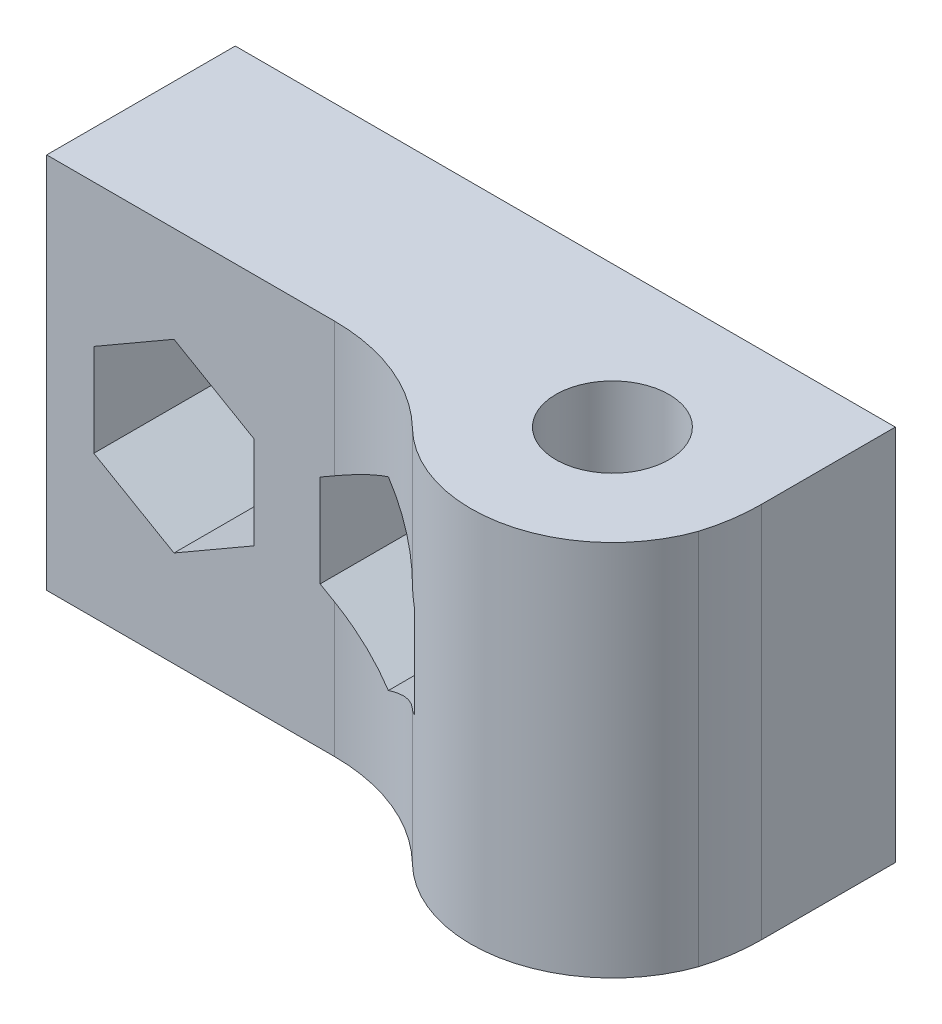
ISO-10303-21;
HEADER;
FILE_DESCRIPTION(('STEP AP214'),'2;1');
FILE_NAME('part.step','',(''),(''),'','','');
FILE_SCHEMA(('AUTOMOTIVE_DESIGN { 1 0 10303 214 1 1 1 1 }'));
ENDSEC;
DATA;
#1=APPLICATION_CONTEXT('core data for automotive mechanical design processes');
#2=APPLICATION_PROTOCOL_DEFINITION('international standard','automotive_design',2000,#1);
#3=PRODUCT_CONTEXT('',#1,'mechanical');
#4=PRODUCT('Part','Part','',(#3));
#5=PRODUCT_RELATED_PRODUCT_CATEGORY('part','',(#4));
#6=PRODUCT_DEFINITION_FORMATION('','',#4);
#7=PRODUCT_DEFINITION_CONTEXT('part definition',#1,'design');
#8=PRODUCT_DEFINITION('design','',#6,#7);
#9=PRODUCT_DEFINITION_SHAPE('','',#8);
#10=(LENGTH_UNIT() NAMED_UNIT(*) SI_UNIT(.MILLI.,.METRE.));
#11=(NAMED_UNIT(*) PLANE_ANGLE_UNIT() SI_UNIT($,.RADIAN.));
#12=(NAMED_UNIT(*) SI_UNIT($,.STERADIAN.) SOLID_ANGLE_UNIT());
#13=UNCERTAINTY_MEASURE_WITH_UNIT(LENGTH_MEASURE(1.E-05),#10,'distance_accuracy_value','');
#14=(GEOMETRIC_REPRESENTATION_CONTEXT(3) GLOBAL_UNCERTAINTY_ASSIGNED_CONTEXT((#13)) GLOBAL_UNIT_ASSIGNED_CONTEXT((#10,
#11,#12)) REPRESENTATION_CONTEXT('',''));
#15=CARTESIAN_POINT('',(0.,0.,0.));
#16=DIRECTION('',(0.,0.,1.));
#17=DIRECTION('',(1.,0.,0.));
#18=AXIS2_PLACEMENT_3D('',#15,#16,#17);
#19=CARTESIAN_POINT('',(0.,0.,10.));
#20=DIRECTION('',(0.,0.,1.));
#21=DIRECTION('',(1.,0.,0.));
#22=AXIS2_PLACEMENT_3D('',#19,#20,#21);
#23=PLANE('',#22);
#24=DIRECTION('',(-0.866025403784438,-0.5,0.));
#25=VECTOR('',#24,1.);
#26=CARTESIAN_POINT('',(3.7676270189222,-6.52572142074251,10.));
#27=LINE('',#26,#25);
#28=CARTESIAN_POINT('',(-6.49999999999999,-12.4537386440559,10.));
#29=VERTEX_POINT('',#28);
#30=CARTESIAN_POINT('',(-10.75,-14.9074772881118,10.));
#31=VERTEX_POINT('',#30);
#32=EDGE_CURVE('E306',#29,#31,#27,.T.);
#33=ORIENTED_EDGE('',*,*,#32,.T.);
#34=DIRECTION('',(-0.866025403784439,0.5,0.));
#35=VECTOR('',#34,1.);
#36=CARTESIAN_POINT('',(-9.14262701892219,-15.8354945114252,10.));
#37=LINE('',#36,#35);
#38=CARTESIAN_POINT('',(-15.,-12.4537386440559,10.));
#39=VERTEX_POINT('',#38);
#40=EDGE_CURVE('E309',#31,#39,#37,.T.);
#41=ORIENTED_EDGE('',*,*,#40,.T.);
#42=DIRECTION('',(0.,1.,0.));
#43=VECTOR('',#42,1.);
#44=CARTESIAN_POINT('',(-15.,0.,10.));
#45=LINE('',#44,#43);
#46=CARTESIAN_POINT('',(-15.,-7.54626135594409,10.));
#47=VERTEX_POINT('',#46);
#48=EDGE_CURVE('E294',#39,#47,#45,.T.);
#49=ORIENTED_EDGE('',*,*,#48,.T.);
#50=DIRECTION('',(0.866025403784439,0.5,0.));
#51=VECTOR('',#50,1.);
#52=CARTESIAN_POINT('',(-0.482372981077803,0.835494511425216,10.));
#53=LINE('',#52,#51);
#54=CARTESIAN_POINT('',(-10.75,-5.09252271188818,10.));
#55=VERTEX_POINT('',#54);
#56=EDGE_CURVE('E297',#47,#55,#53,.T.);
#57=ORIENTED_EDGE('',*,*,#56,.T.);
#58=DIRECTION('',(0.866025403784438,-0.500000000000001,0.));
#59=VECTOR('',#58,1.);
#60=CARTESIAN_POINT('',(-4.8926270189222,-8.47427857925749,10.));
#61=LINE('',#60,#59);
#62=CARTESIAN_POINT('',(-6.49999999999999,-7.54626135594409,10.));
#63=VERTEX_POINT('',#62);
#64=EDGE_CURVE('E300',#55,#63,#61,.T.);
#65=ORIENTED_EDGE('',*,*,#64,.T.);
#66=DIRECTION('',(0.,-1.,0.));
#67=VECTOR('',#66,1.);
#68=CARTESIAN_POINT('',(-6.49999999999999,0.,10.));
#69=LINE('',#68,#67);
#70=EDGE_CURVE('E303',#63,#29,#69,.T.);
#71=ORIENTED_EDGE('',*,*,#70,.T.);
#72=EDGE_LOOP('',(#33,#41,#49,#57,#65,#71));
#73=FACE_BOUND('',#72,.T.);
#74=DIRECTION('',(1.,0.,0.));
#75=VECTOR('',#74,1.);
#76=CARTESIAN_POINT('',(-17.5,-20.,10.));
#77=LINE('',#76,#75);
#78=CARTESIAN_POINT('',(-17.5,-20.,10.));
#79=VERTEX_POINT('',#78);
#80=CARTESIAN_POINT('',(-2.24744871391589,-20.,10.));
#81=VERTEX_POINT('',#80);
#82=EDGE_CURVE('E269',#79,#81,#77,.T.);
#83=ORIENTED_EDGE('',*,*,#82,.T.);
#84=DIRECTION('',(0.,-1.,0.));
#85=VECTOR('',#84,1.);
#86=CARTESIAN_POINT('',(-2.24744871391589,-13.9381453373412,10.));
#87=LINE('',#86,#85);
#88=CARTESIAN_POINT('',(-2.24744871391588,-12.8882243316556,10.));
#89=VERTEX_POINT('',#88);
#90=EDGE_CURVE('E336',#81,#89,#87,.F.);
#91=ORIENTED_EDGE('',*,*,#90,.T.);
#92=DIRECTION('',(-0.866025403784439,0.5,0.));
#93=VECTOR('',#92,1.);
#94=CARTESIAN_POINT('',(-6.14262701892219,-10.6393420887186,10.));
#95=LINE('',#94,#93);
#96=CARTESIAN_POINT('',(-2.99999999999999,-12.4537386440559,10.));
#97=VERTEX_POINT('',#96);
#98=EDGE_CURVE('E326',#89,#97,#95,.T.);
#99=ORIENTED_EDGE('',*,*,#98,.T.);
#100=DIRECTION('',(0.,1.,0.));
#101=VECTOR('',#100,1.);
#102=CARTESIAN_POINT('',(-2.99999999999999,0.,10.));
#103=LINE('',#102,#101);
#104=CARTESIAN_POINT('',(-2.99999999999999,-7.54626135594409,10.));
#105=VERTEX_POINT('',#104);
#106=EDGE_CURVE('E320',#97,#105,#103,.T.);
#107=ORIENTED_EDGE('',*,*,#106,.T.);
#108=DIRECTION('',(0.866025403784439,0.5,0.));
#109=VECTOR('',#108,1.);
#110=CARTESIAN_POINT('',(2.51762701892219,-4.36065791128141,10.));
#111=LINE('',#110,#109);
#112=CARTESIAN_POINT('',(-2.24744871391589,-7.11177566834444,10.));
#113=VERTEX_POINT('',#112);
#114=EDGE_CURVE('E323',#105,#113,#111,.T.);
#115=ORIENTED_EDGE('',*,*,#114,.T.);
#116=DIRECTION('',(0.,-1.,0.));
#117=VECTOR('',#116,1.);
#118=CARTESIAN_POINT('',(-2.24744871391589,0.,10.));
#119=LINE('',#118,#117);
#120=CARTESIAN_POINT('',(-2.24744871391589,0.,10.));
#121=VERTEX_POINT('',#120);
#122=EDGE_CURVE('E334',#113,#121,#119,.F.);
#123=ORIENTED_EDGE('',*,*,#122,.T.);
#124=DIRECTION('',(-1.,0.,0.));
#125=VECTOR('',#124,1.);
#126=CARTESIAN_POINT('',(-17.5,0.,10.));
#127=LINE('',#126,#125);
#128=CARTESIAN_POINT('',(-17.5,0.,10.));
#129=VERTEX_POINT('',#128);
#130=EDGE_CURVE('E273',#121,#129,#127,.T.);
#131=ORIENTED_EDGE('',*,*,#130,.T.);
#132=DIRECTION('',(0.,-1.,0.));
#133=VECTOR('',#132,1.);
#134=CARTESIAN_POINT('',(-17.5,0.,10.));
#135=LINE('',#134,#133);
#136=EDGE_CURVE('E266',#129,#79,#135,.T.);
#137=ORIENTED_EDGE('',*,*,#136,.T.);
#138=EDGE_LOOP('',(#83,#91,#99,#107,#115,#123,#131,#137));
#139=FACE_BOUND('',#138,.T.);
#140=ADVANCED_FACE('F33',(#73,#139),#23,.T.);
#141=CARTESIAN_POINT('',(10.,-20.,7.5));
#142=DIRECTION('',(0.,1.,0.));
#143=DIRECTION('',(-1.,0.,0.));
#144=AXIS2_PLACEMENT_3D('',#141,#142,#143);
#145=CYLINDRICAL_SURFACE('',#144,7.5);
#146=CARTESIAN_POINT('',(10.,-9.8556624327026,7.5));
#147=DIRECTION('',(-0.5,0.866025403784438,0.));
#148=DIRECTION('',(0.866025403784438,0.5,0.));
#149=AXIS2_PLACEMENT_3D('',#146,#147,#148);
#150=ELLIPSE('',#149,8.66025403784439,7.5);
#151=CARTESIAN_POINT('',(5.50000000000001,-12.4537386440559,13.5));
#152=VERTEX_POINT('',#151);
#153=CARTESIAN_POINT('',(4.75109340832176,-12.8861200663592,12.8571428571429));
#154=VERTEX_POINT('',#153);
#155=EDGE_CURVE('E317',#152,#154,#150,.F.);
#156=ORIENTED_EDGE('',*,*,#155,.T.);
#157=DIRECTION('',(0.,1.,0.));
#158=VECTOR('',#157,1.);
#159=CARTESIAN_POINT('',(4.75109340832177,-20.,12.8571428571429));
#160=LINE('',#159,#158);
#161=CARTESIAN_POINT('',(4.75109340832177,-20.,12.8571428571429));
#162=VERTEX_POINT('',#161);
#163=EDGE_CURVE('E331',#154,#162,#160,.F.);
#164=ORIENTED_EDGE('',*,*,#163,.T.);
#165=CARTESIAN_POINT('',(10.,-20.,7.5));
#166=DIRECTION('',(0.,1.,0.));
#167=DIRECTION('',(-1.,0.,0.));
#168=AXIS2_PLACEMENT_3D('',#165,#166,#167);
#169=CIRCLE('',#168,7.5);
#170=CARTESIAN_POINT('',(17.0710678118655,-20.,10.));
#171=VERTEX_POINT('',#170);
#172=EDGE_CURVE('E257',#162,#171,#169,.T.);
#173=ORIENTED_EDGE('',*,*,#172,.T.);
#174=DIRECTION('',(0.,1.,0.));
#175=VECTOR('',#174,1.);
#176=CARTESIAN_POINT('',(17.0710678118655,-20.,10.));
#177=LINE('',#176,#175);
#178=CARTESIAN_POINT('',(17.0710678118655,0.,10.));
#179=VERTEX_POINT('',#178);
#180=EDGE_CURVE('E260',#171,#179,#177,.T.);
#181=ORIENTED_EDGE('',*,*,#180,.T.);
#182=CARTESIAN_POINT('',(10.,0.,7.5));
#183=DIRECTION('',(0.,1.,0.));
#184=DIRECTION('',(-1.,0.,0.));
#185=AXIS2_PLACEMENT_3D('',#182,#183,#184);
#186=CIRCLE('',#185,7.5);
#187=CARTESIAN_POINT('',(4.75109340832176,0.,12.8571428571429));
#188=VERTEX_POINT('',#187);
#189=EDGE_CURVE('E256',#188,#179,#186,.T.);
#190=ORIENTED_EDGE('',*,*,#189,.F.);
#191=DIRECTION('',(0.,1.,0.));
#192=VECTOR('',#191,1.);
#193=CARTESIAN_POINT('',(4.75109340832177,-20.,12.8571428571429));
#194=LINE('',#193,#192);
#195=CARTESIAN_POINT('',(4.75109340832177,-7.11387993364077,12.8571428571429));
#196=VERTEX_POINT('',#195);
#197=EDGE_CURVE('E328',#188,#196,#194,.F.);
#198=ORIENTED_EDGE('',*,*,#197,.T.);
#199=CARTESIAN_POINT('',(10.,-10.1443375672974,7.5));
#200=DIRECTION('',(-0.500000000000001,-0.866025403784438,0.));
#201=DIRECTION('',(-0.866025403784438,0.500000000000001,0.));
#202=AXIS2_PLACEMENT_3D('',#199,#200,#201);
#203=ELLIPSE('',#202,8.66025403784439,7.5);
#204=CARTESIAN_POINT('',(5.50000000000001,-7.54626135594409,13.5));
#205=VERTEX_POINT('',#204);
#206=EDGE_CURVE('E312',#196,#205,#203,.F.);
#207=ORIENTED_EDGE('',*,*,#206,.T.);
#208=DIRECTION('',(0.,1.,0.));
#209=VECTOR('',#208,1.);
#210=CARTESIAN_POINT('',(5.50000000000001,-20.,13.5));
#211=LINE('',#210,#209);
#212=EDGE_CURVE('E314',#205,#152,#211,.F.);
#213=ORIENTED_EDGE('',*,*,#212,.T.);
#214=EDGE_LOOP('',(#156,#164,#173,#181,#190,#198,#207,#213));
#215=FACE_BOUND('',#214,.T.);
#216=ADVANCED_FACE('F365',(#215),#145,.T.);
#217=CARTESIAN_POINT('',(-17.5,0.,10.));
#218=DIRECTION('',(1.,0.,0.));
#219=DIRECTION('',(0.,1.,0.));
#220=AXIS2_PLACEMENT_3D('',#217,#218,#219);
#221=PLANE('',#220);
#222=DIRECTION('',(0.,-1.,0.));
#223=VECTOR('',#222,1.);
#224=CARTESIAN_POINT('',(-17.5,0.,0.));
#225=LINE('',#224,#223);
#226=CARTESIAN_POINT('',(-17.5,0.,0.));
#227=VERTEX_POINT('',#226);
#228=CARTESIAN_POINT('',(-17.5,-20.,0.));
#229=VERTEX_POINT('',#228);
#230=EDGE_CURVE('E265',#227,#229,#225,.T.);
#231=ORIENTED_EDGE('',*,*,#230,.T.);
#232=DIRECTION('',(0.,0.,-1.));
#233=VECTOR('',#232,1.);
#234=CARTESIAN_POINT('',(-17.5,-20.,10.));
#235=LINE('',#234,#233);
#236=EDGE_CURVE('E291',#79,#229,#235,.T.);
#237=ORIENTED_EDGE('',*,*,#236,.F.);
#238=ORIENTED_EDGE('',*,*,#136,.F.);
#239=DIRECTION('',(0.,0.,-1.));
#240=VECTOR('',#239,1.);
#241=CARTESIAN_POINT('',(-17.5,0.,10.));
#242=LINE('',#241,#240);
#243=EDGE_CURVE('E275',#129,#227,#242,.T.);
#244=ORIENTED_EDGE('',*,*,#243,.T.);
#245=EDGE_LOOP('',(#231,#237,#238,#244));
#246=FACE_BOUND('',#245,.T.);
#247=ADVANCED_FACE('F384',(#246),#221,.F.);
#248=CARTESIAN_POINT('',(-17.5,-20.,10.));
#249=DIRECTION('',(0.,1.,0.));
#250=DIRECTION('',(-1.,0.,0.));
#251=AXIS2_PLACEMENT_3D('',#248,#249,#250);
#252=PLANE('',#251);
#253=CARTESIAN_POINT('',(10.,-20.,7.5));
#254=DIRECTION('',(0.,1.,0.));
#255=DIRECTION('',(-1.,0.,0.));
#256=AXIS2_PLACEMENT_3D('',#253,#254,#255);
#257=CIRCLE('',#256,3.);
#258=CARTESIAN_POINT('',(7.,-20.,7.5));
#259=VERTEX_POINT('',#258);
#260=EDGE_CURVE('E667',#259,#259,#257,.T.);
#261=ORIENTED_EDGE('',*,*,#260,.T.);
#262=EDGE_LOOP('',(#261));
#263=FACE_BOUND('',#262,.T.);
#264=DIRECTION('',(0.,0.,-1.));
#265=VECTOR('',#264,1.);
#266=CARTESIAN_POINT('',(17.5,-20.,10.));
#267=LINE('',#266,#265);
#268=CARTESIAN_POINT('',(17.5,-20.,7.10264587240832));
#269=VERTEX_POINT('',#268);
#270=CARTESIAN_POINT('',(17.5,-20.,0.));
#271=VERTEX_POINT('',#270);
#272=EDGE_CURVE('E289',#269,#271,#267,.T.);
#273=ORIENTED_EDGE('',*,*,#272,.F.);
#274=CARTESIAN_POINT('',(7.5,-20.,7.10264587240832));
#275=DIRECTION('',(0.,1.,0.));
#276=DIRECTION('',(-1.,0.,0.));
#277=AXIS2_PLACEMENT_3D('',#274,#275,#276);
#278=CIRCLE('',#277,10.);
#279=EDGE_CURVE('E342',#269,#171,#278,.F.);
#280=ORIENTED_EDGE('',*,*,#279,.T.);
#281=ORIENTED_EDGE('',*,*,#172,.F.);
#282=CARTESIAN_POINT('',(-2.24744871391589,-20.,20.));
#283=DIRECTION('',(0.,1.,0.));
#284=DIRECTION('',(-1.,0.,0.));
#285=AXIS2_PLACEMENT_3D('',#282,#283,#284);
#286=CIRCLE('',#285,10.);
#287=EDGE_CURVE('E344',#162,#81,#286,.T.);
#288=ORIENTED_EDGE('',*,*,#287,.T.);
#289=ORIENTED_EDGE('',*,*,#82,.F.);
#290=ORIENTED_EDGE('',*,*,#236,.T.);
#291=DIRECTION('',(1.,0.,0.));
#292=VECTOR('',#291,1.);
#293=CARTESIAN_POINT('',(-17.5,-20.,0.));
#294=LINE('',#293,#292);
#295=EDGE_CURVE('E278',#229,#271,#294,.T.);
#296=ORIENTED_EDGE('',*,*,#295,.T.);
#297=EDGE_LOOP('',(#273,#280,#281,#288,#289,#290,#296));
#298=FACE_BOUND('',#297,.T.);
#299=ADVANCED_FACE('F428',(#263,#298),#252,.F.);
#300=CARTESIAN_POINT('',(17.5,0.,10.));
#301=DIRECTION('',(-1.,0.,0.));
#302=DIRECTION('',(0.,0.,1.));
#303=AXIS2_PLACEMENT_3D('',#300,#301,#302);
#304=PLANE('',#303);
#305=DIRECTION('',(0.,0.,-1.));
#306=VECTOR('',#305,1.);
#307=CARTESIAN_POINT('',(17.5,0.,10.));
#308=LINE('',#307,#306);
#309=CARTESIAN_POINT('',(17.5,0.,7.10264587240832));
#310=VERTEX_POINT('',#309);
#311=CARTESIAN_POINT('',(17.5,0.,0.));
#312=VERTEX_POINT('',#311);
#313=EDGE_CURVE('E287',#310,#312,#308,.T.);
#314=ORIENTED_EDGE('',*,*,#313,.F.);
#315=DIRECTION('',(0.,1.,0.));
#316=VECTOR('',#315,1.);
#317=CARTESIAN_POINT('',(17.5,0.,7.10264587240832));
#318=LINE('',#317,#316);
#319=EDGE_CURVE('E340',#310,#269,#318,.F.);
#320=ORIENTED_EDGE('',*,*,#319,.T.);
#321=ORIENTED_EDGE('',*,*,#272,.T.);
#322=DIRECTION('',(0.,1.,0.));
#323=VECTOR('',#322,1.);
#324=CARTESIAN_POINT('',(17.5,0.,0.));
#325=LINE('',#324,#323);
#326=EDGE_CURVE('E281',#271,#312,#325,.T.);
#327=ORIENTED_EDGE('',*,*,#326,.T.);
#328=EDGE_LOOP('',(#314,#320,#321,#327));
#329=FACE_BOUND('',#328,.T.);
#330=ADVANCED_FACE('F375',(#329),#304,.F.);
#331=CARTESIAN_POINT('',(-17.5,0.,10.));
#332=DIRECTION('',(0.,-1.,0.));
#333=DIRECTION('',(1.,0.,0.));
#334=AXIS2_PLACEMENT_3D('',#331,#332,#333);
#335=PLANE('',#334);
#336=CARTESIAN_POINT('',(10.,0.,7.5));
#337=DIRECTION('',(0.,1.,0.));
#338=DIRECTION('',(-1.,0.,0.));
#339=AXIS2_PLACEMENT_3D('',#336,#337,#338);
#340=CIRCLE('',#339,3.);
#341=CARTESIAN_POINT('',(7.,0.,7.5));
#342=VERTEX_POINT('',#341);
#343=EDGE_CURVE('E669',#342,#342,#340,.T.);
#344=ORIENTED_EDGE('',*,*,#343,.F.);
#345=EDGE_LOOP('',(#344));
#346=FACE_BOUND('',#345,.T.);
#347=ORIENTED_EDGE('',*,*,#189,.T.);
#348=CARTESIAN_POINT('',(7.5,0.,7.10264587240832));
#349=DIRECTION('',(0.,-1.,0.));
#350=DIRECTION('',(1.,0.,0.));
#351=AXIS2_PLACEMENT_3D('',#348,#349,#350);
#352=CIRCLE('',#351,10.);
#353=EDGE_CURVE('E338',#179,#310,#352,.F.);
#354=ORIENTED_EDGE('',*,*,#353,.T.);
#355=ORIENTED_EDGE('',*,*,#313,.T.);
#356=DIRECTION('',(-1.,0.,0.));
#357=VECTOR('',#356,1.);
#358=CARTESIAN_POINT('',(-17.5,0.,0.));
#359=LINE('',#358,#357);
#360=EDGE_CURVE('E270',#312,#227,#359,.T.);
#361=ORIENTED_EDGE('',*,*,#360,.T.);
#362=ORIENTED_EDGE('',*,*,#243,.F.);
#363=ORIENTED_EDGE('',*,*,#130,.F.);
#364=CARTESIAN_POINT('',(-2.24744871391589,0.,20.));
#365=DIRECTION('',(0.,-1.,0.));
#366=DIRECTION('',(1.,0.,0.));
#367=AXIS2_PLACEMENT_3D('',#364,#365,#366);
#368=CIRCLE('',#367,10.);
#369=EDGE_CURVE('E11',#121,#188,#368,.T.);
#370=ORIENTED_EDGE('',*,*,#369,.T.);
#371=EDGE_LOOP('',(#347,#354,#355,#361,#362,#363,#370));
#372=FACE_BOUND('',#371,.T.);
#373=ADVANCED_FACE('F362',(#346,#372),#335,.F.);
#374=CARTESIAN_POINT('',(0.,0.,0.));
#375=DIRECTION('',(0.,0.,1.));
#376=DIRECTION('',(1.,0.,0.));
#377=AXIS2_PLACEMENT_3D('',#374,#375,#376);
#378=PLANE('',#377);
#379=CARTESIAN_POINT('',(1.25000000000002,-10.,0.));
#380=DIRECTION('',(0.,0.,1.));
#381=DIRECTION('',(1.,0.,0.));
#382=AXIS2_PLACEMENT_3D('',#379,#380,#381);
#383=CIRCLE('',#382,2.75);
#384=CARTESIAN_POINT('',(4.00000000000002,-10.,0.));
#385=VERTEX_POINT('',#384);
#386=EDGE_CURVE('E199',#385,#385,#383,.T.);
#387=ORIENTED_EDGE('',*,*,#386,.T.);
#388=EDGE_LOOP('',(#387));
#389=FACE_BOUND('',#388,.T.);
#390=CARTESIAN_POINT('',(-10.75,-10.,0.));
#391=DIRECTION('',(0.,0.,1.));
#392=DIRECTION('',(1.,0.,0.));
#393=AXIS2_PLACEMENT_3D('',#390,#391,#392);
#394=CIRCLE('',#393,2.75);
#395=CARTESIAN_POINT('',(-7.99999999999998,-10.,0.));
#396=VERTEX_POINT('',#395);
#397=EDGE_CURVE('E221',#396,#396,#394,.T.);
#398=ORIENTED_EDGE('',*,*,#397,.T.);
#399=EDGE_LOOP('',(#398));
#400=FACE_BOUND('',#399,.T.);
#401=ORIENTED_EDGE('',*,*,#326,.F.);
#402=ORIENTED_EDGE('',*,*,#295,.F.);
#403=ORIENTED_EDGE('',*,*,#230,.F.);
#404=ORIENTED_EDGE('',*,*,#360,.F.);
#405=EDGE_LOOP('',(#401,#402,#403,#404));
#406=FACE_BOUND('',#405,.T.);
#407=ADVANCED_FACE('F381',(#389,#400,#406),#378,.F.);
#408=CARTESIAN_POINT('',(-15.,-12.4537386440559,20.));
#409=DIRECTION('',(0.5,0.866025403784439,0.));
#410=DIRECTION('',(-0.866025403784439,0.5,0.));
#411=AXIS2_PLACEMENT_3D('',#408,#409,#410);
#412=PLANE('',#411);
#413=DIRECTION('',(0.,0.,-1.));
#414=VECTOR('',#413,1.);
#415=CARTESIAN_POINT('',(-10.75,-14.9074772881118,20.));
#416=LINE('',#415,#414);
#417=CARTESIAN_POINT('',(-10.75,-14.9074772881118,2.5));
#418=VERTEX_POINT('',#417);
#419=EDGE_CURVE('E254',#31,#418,#416,.T.);
#420=ORIENTED_EDGE('',*,*,#419,.T.);
#421=DIRECTION('',(0.866025403784439,-0.5,0.));
#422=VECTOR('',#421,1.);
#423=CARTESIAN_POINT('',(-15.,-12.4537386440559,2.5));
#424=LINE('',#423,#422);
#425=CARTESIAN_POINT('',(-15.,-12.4537386440559,2.5));
#426=VERTEX_POINT('',#425);
#427=EDGE_CURVE('E224',#426,#418,#424,.T.);
#428=ORIENTED_EDGE('',*,*,#427,.F.);
#429=DIRECTION('',(0.,0.,-1.));
#430=VECTOR('',#429,1.);
#431=CARTESIAN_POINT('',(-15.,-12.4537386440559,20.));
#432=LINE('',#431,#430);
#433=EDGE_CURVE('E244',#39,#426,#432,.T.);
#434=ORIENTED_EDGE('',*,*,#433,.F.);
#435=ORIENTED_EDGE('',*,*,#40,.F.);
#436=EDGE_LOOP('',(#420,#428,#434,#435));
#437=FACE_BOUND('',#436,.T.);
#438=ADVANCED_FACE('F421',(#437),#412,.T.);
#439=CARTESIAN_POINT('',(-10.75,-14.9074772881118,20.));
#440=DIRECTION('',(-0.5,0.866025403784438,0.));
#441=DIRECTION('',(-0.866025403784438,-0.5,0.));
#442=AXIS2_PLACEMENT_3D('',#439,#440,#441);
#443=PLANE('',#442);
#444=DIRECTION('',(0.,0.,-1.));
#445=VECTOR('',#444,1.);
#446=CARTESIAN_POINT('',(-6.49999999999999,-12.4537386440559,20.));
#447=LINE('',#446,#445);
#448=CARTESIAN_POINT('',(-6.49999999999999,-12.4537386440559,2.5));
#449=VERTEX_POINT('',#448);
#450=EDGE_CURVE('E252',#29,#449,#447,.T.);
#451=ORIENTED_EDGE('',*,*,#450,.T.);
#452=DIRECTION('',(0.866025403784438,0.5,0.));
#453=VECTOR('',#452,1.);
#454=CARTESIAN_POINT('',(-10.75,-14.9074772881118,2.5));
#455=LINE('',#454,#453);
#456=EDGE_CURVE('E229',#418,#449,#455,.T.);
#457=ORIENTED_EDGE('',*,*,#456,.F.);
#458=ORIENTED_EDGE('',*,*,#419,.F.);
#459=ORIENTED_EDGE('',*,*,#32,.F.);
#460=EDGE_LOOP('',(#451,#457,#458,#459));
#461=FACE_BOUND('',#460,.T.);
#462=ADVANCED_FACE('F616',(#461),#443,.T.);
#463=CARTESIAN_POINT('',(-6.49999999999999,-12.4537386440559,20.));
#464=DIRECTION('',(-1.,0.,0.));
#465=DIRECTION('',(0.,-1.,0.));
#466=AXIS2_PLACEMENT_3D('',#463,#464,#465);
#467=PLANE('',#466);
#468=DIRECTION('',(0.,0.,-1.));
#469=VECTOR('',#468,1.);
#470=CARTESIAN_POINT('',(-6.49999999999999,-7.54626135594409,20.));
#471=LINE('',#470,#469);
#472=CARTESIAN_POINT('',(-6.49999999999999,-7.54626135594409,2.5));
#473=VERTEX_POINT('',#472);
#474=EDGE_CURVE('E250',#63,#473,#471,.T.);
#475=ORIENTED_EDGE('',*,*,#474,.T.);
#476=DIRECTION('',(0.,1.,0.));
#477=VECTOR('',#476,1.);
#478=CARTESIAN_POINT('',(-6.49999999999999,-12.4537386440559,2.5));
#479=LINE('',#478,#477);
#480=EDGE_CURVE('E232',#449,#473,#479,.T.);
#481=ORIENTED_EDGE('',*,*,#480,.F.);
#482=ORIENTED_EDGE('',*,*,#450,.F.);
#483=ORIENTED_EDGE('',*,*,#70,.F.);
#484=EDGE_LOOP('',(#475,#481,#482,#483));
#485=FACE_BOUND('',#484,.T.);
#486=ADVANCED_FACE('F606',(#485),#467,.T.);
#487=CARTESIAN_POINT('',(-6.49999999999999,-7.54626135594409,20.));
#488=DIRECTION('',(-0.500000000000001,-0.866025403784438,0.));
#489=DIRECTION('',(0.866025403784438,-0.500000000000001,0.));
#490=AXIS2_PLACEMENT_3D('',#487,#488,#489);
#491=PLANE('',#490);
#492=DIRECTION('',(0.,0.,-1.));
#493=VECTOR('',#492,1.);
#494=CARTESIAN_POINT('',(-10.75,-5.09252271188818,20.));
#495=LINE('',#494,#493);
#496=CARTESIAN_POINT('',(-10.75,-5.09252271188818,2.5));
#497=VERTEX_POINT('',#496);
#498=EDGE_CURVE('E248',#55,#497,#495,.T.);
#499=ORIENTED_EDGE('',*,*,#498,.T.);
#500=DIRECTION('',(-0.866025403784438,0.500000000000001,0.));
#501=VECTOR('',#500,1.);
#502=CARTESIAN_POINT('',(-6.49999999999999,-7.54626135594409,2.5));
#503=LINE('',#502,#501);
#504=EDGE_CURVE('E235',#473,#497,#503,.T.);
#505=ORIENTED_EDGE('',*,*,#504,.F.);
#506=ORIENTED_EDGE('',*,*,#474,.F.);
#507=ORIENTED_EDGE('',*,*,#64,.F.);
#508=EDGE_LOOP('',(#499,#505,#506,#507));
#509=FACE_BOUND('',#508,.T.);
#510=ADVANCED_FACE('F596',(#509),#491,.T.);
#511=CARTESIAN_POINT('',(-10.75,-5.09252271188818,20.));
#512=DIRECTION('',(0.5,-0.866025403784439,0.));
#513=DIRECTION('',(0.866025403784439,0.5,0.));
#514=AXIS2_PLACEMENT_3D('',#511,#512,#513);
#515=PLANE('',#514);
#516=DIRECTION('',(0.,0.,-1.));
#517=VECTOR('',#516,1.);
#518=CARTESIAN_POINT('',(-15.,-7.54626135594409,20.));
#519=LINE('',#518,#517);
#520=CARTESIAN_POINT('',(-15.,-7.54626135594409,2.5));
#521=VERTEX_POINT('',#520);
#522=EDGE_CURVE('E246',#47,#521,#519,.T.);
#523=ORIENTED_EDGE('',*,*,#522,.T.);
#524=DIRECTION('',(-0.866025403784439,-0.5,0.));
#525=VECTOR('',#524,1.);
#526=CARTESIAN_POINT('',(-10.75,-5.09252271188818,2.5));
#527=LINE('',#526,#525);
#528=EDGE_CURVE('E238',#497,#521,#527,.T.);
#529=ORIENTED_EDGE('',*,*,#528,.F.);
#530=ORIENTED_EDGE('',*,*,#498,.F.);
#531=ORIENTED_EDGE('',*,*,#56,.F.);
#532=EDGE_LOOP('',(#523,#529,#530,#531));
#533=FACE_BOUND('',#532,.T.);
#534=ADVANCED_FACE('F586',(#533),#515,.T.);
#535=CARTESIAN_POINT('',(-15.,-7.54626135594409,20.));
#536=DIRECTION('',(1.,0.,0.));
#537=DIRECTION('',(0.,1.,0.));
#538=AXIS2_PLACEMENT_3D('',#535,#536,#537);
#539=PLANE('',#538);
#540=ORIENTED_EDGE('',*,*,#433,.T.);
#541=DIRECTION('',(0.,-1.,0.));
#542=VECTOR('',#541,1.);
#543=CARTESIAN_POINT('',(-15.,-7.54626135594409,2.5));
#544=LINE('',#543,#542);
#545=EDGE_CURVE('E241',#521,#426,#544,.T.);
#546=ORIENTED_EDGE('',*,*,#545,.F.);
#547=ORIENTED_EDGE('',*,*,#522,.F.);
#548=ORIENTED_EDGE('',*,*,#48,.F.);
#549=EDGE_LOOP('',(#540,#546,#547,#548));
#550=FACE_BOUND('',#549,.T.);
#551=ADVANCED_FACE('F576',(#550),#539,.T.);
#552=CARTESIAN_POINT('',(0.,0.,2.5));
#553=DIRECTION('',(0.,0.,1.));
#554=DIRECTION('',(1.,0.,0.));
#555=AXIS2_PLACEMENT_3D('',#552,#553,#554);
#556=PLANE('',#555);
#557=CARTESIAN_POINT('',(-10.75,-10.,2.5));
#558=DIRECTION('',(0.,0.,1.));
#559=DIRECTION('',(1.,0.,0.));
#560=AXIS2_PLACEMENT_3D('',#557,#558,#559);
#561=CIRCLE('',#560,2.75);
#562=CARTESIAN_POINT('',(-7.99999999999998,-10.,2.5));
#563=VERTEX_POINT('',#562);
#564=EDGE_CURVE('E183',#563,#563,#561,.T.);
#565=ORIENTED_EDGE('',*,*,#564,.F.);
#566=EDGE_LOOP('',(#565));
#567=FACE_BOUND('',#566,.T.);
#568=ORIENTED_EDGE('',*,*,#427,.T.);
#569=ORIENTED_EDGE('',*,*,#456,.T.);
#570=ORIENTED_EDGE('',*,*,#480,.T.);
#571=ORIENTED_EDGE('',*,*,#504,.T.);
#572=ORIENTED_EDGE('',*,*,#528,.T.);
#573=ORIENTED_EDGE('',*,*,#545,.T.);
#574=EDGE_LOOP('',(#568,#569,#570,#571,#572,#573));
#575=FACE_BOUND('',#574,.T.);
#576=ADVANCED_FACE('F566',(#567,#575),#556,.T.);
#577=CARTESIAN_POINT('',(-10.75,-10.,0.));
#578=DIRECTION('',(0.,0.,1.));
#579=DIRECTION('',(1.,0.,0.));
#580=AXIS2_PLACEMENT_3D('',#577,#578,#579);
#581=CYLINDRICAL_SURFACE('',#580,2.75);
#582=ORIENTED_EDGE('',*,*,#397,.F.);
#583=EDGE_LOOP('',(#582));
#584=FACE_BOUND('',#583,.T.);
#585=ORIENTED_EDGE('',*,*,#564,.T.);
#586=EDGE_LOOP('',(#585));
#587=FACE_BOUND('',#586,.T.);
#588=ADVANCED_FACE('F488',(#584,#587),#581,.F.);
#589=CARTESIAN_POINT('',(-2.99999999999999,-12.4537386440559,20.));
#590=DIRECTION('',(0.5,0.866025403784439,0.));
#591=DIRECTION('',(-0.866025403784439,0.5,0.));
#592=AXIS2_PLACEMENT_3D('',#589,#590,#591);
#593=PLANE('',#592);
#594=DIRECTION('',(0.,0.,-1.));
#595=VECTOR('',#594,1.);
#596=CARTESIAN_POINT('',(1.25000000000001,-14.9074772881118,20.));
#597=LINE('',#596,#595);
#598=CARTESIAN_POINT('',(1.25000000000001,-14.9074772881118,10.6315501552536));
#599=VERTEX_POINT('',#598);
#600=CARTESIAN_POINT('',(1.25000000000001,-14.9074772881118,2.5));
#601=VERTEX_POINT('',#600);
#602=EDGE_CURVE('E56',#599,#601,#597,.T.);
#603=ORIENTED_EDGE('',*,*,#602,.T.);
#604=DIRECTION('',(0.866025403784439,-0.5,0.));
#605=VECTOR('',#604,1.);
#606=CARTESIAN_POINT('',(-2.99999999999999,-12.4537386440559,2.5));
#607=LINE('',#606,#605);
#608=CARTESIAN_POINT('',(-2.99999999999999,-12.4537386440559,2.5));
#609=VERTEX_POINT('',#608);
#610=EDGE_CURVE('E177',#609,#601,#607,.T.);
#611=ORIENTED_EDGE('',*,*,#610,.F.);
#612=DIRECTION('',(0.,0.,-1.));
#613=VECTOR('',#612,1.);
#614=CARTESIAN_POINT('',(-2.99999999999999,-12.4537386440559,20.));
#615=LINE('',#614,#613);
#616=EDGE_CURVE('E213',#97,#609,#615,.T.);
#617=ORIENTED_EDGE('',*,*,#616,.F.);
#618=ORIENTED_EDGE('',*,*,#98,.F.);
#619=CARTESIAN_POINT('',(-2.24744871391589,-12.8882243316556,20.));
#620=DIRECTION('',(0.5,0.866025403784439,0.));
#621=DIRECTION('',(-0.866025403784439,0.5,0.));
#622=AXIS2_PLACEMENT_3D('',#619,#620,#621);
#623=ELLIPSE('',#622,11.5470053837925,10.);
#624=EDGE_CURVE('E181',#89,#599,#623,.F.);
#625=ORIENTED_EDGE('',*,*,#624,.T.);
#626=EDGE_LOOP('',(#603,#611,#617,#618,#625));
#627=FACE_BOUND('',#626,.T.);
#628=ADVANCED_FACE('F174',(#627),#593,.T.);
#629=CARTESIAN_POINT('',(1.25000000000001,-14.9074772881118,20.));
#630=DIRECTION('',(-0.5,0.866025403784438,0.));
#631=DIRECTION('',(-0.866025403784438,-0.5,0.));
#632=AXIS2_PLACEMENT_3D('',#629,#630,#631);
#633=PLANE('',#632);
#634=ORIENTED_EDGE('',*,*,#155,.F.);
#635=DIRECTION('',(0.,0.,-1.));
#636=VECTOR('',#635,1.);
#637=CARTESIAN_POINT('',(5.50000000000001,-12.4537386440559,20.));
#638=LINE('',#637,#636);
#639=CARTESIAN_POINT('',(5.50000000000001,-12.4537386440559,2.5));
#640=VERTEX_POINT('',#639);
#641=EDGE_CURVE('E184',#152,#640,#638,.T.);
#642=ORIENTED_EDGE('',*,*,#641,.T.);
#643=DIRECTION('',(0.866025403784438,0.5,0.));
#644=VECTOR('',#643,1.);
#645=CARTESIAN_POINT('',(1.25000000000001,-14.9074772881118,2.5));
#646=LINE('',#645,#644);
#647=EDGE_CURVE('E187',#601,#640,#646,.T.);
#648=ORIENTED_EDGE('',*,*,#647,.F.);
#649=ORIENTED_EDGE('',*,*,#602,.F.);
#650=CARTESIAN_POINT('',(-2.24744871391589,-16.9267302445681,20.));
#651=DIRECTION('',(-0.5,0.866025403784438,0.));
#652=DIRECTION('',(0.866025403784438,0.5,0.));
#653=AXIS2_PLACEMENT_3D('',#650,#651,#652);
#654=ELLIPSE('',#653,11.5470053837925,10.);
#655=EDGE_CURVE('E347',#599,#154,#654,.F.);
#656=ORIENTED_EDGE('',*,*,#655,.T.);
#657=EDGE_LOOP('',(#634,#642,#648,#649,#656));
#658=FACE_BOUND('',#657,.T.);
#659=ADVANCED_FACE('F188',(#658),#633,.T.);
#660=CARTESIAN_POINT('',(5.50000000000001,-12.4537386440559,20.));
#661=DIRECTION('',(-1.,0.,0.));
#662=DIRECTION('',(0.,-1.,0.));
#663=AXIS2_PLACEMENT_3D('',#660,#661,#662);
#664=PLANE('',#663);
#665=DIRECTION('',(0.,0.,-1.));
#666=VECTOR('',#665,1.);
#667=CARTESIAN_POINT('',(5.50000000000001,-7.54626135594409,20.));
#668=LINE('',#667,#666);
#669=CARTESIAN_POINT('',(5.50000000000001,-7.54626135594409,2.5));
#670=VERTEX_POINT('',#669);
#671=EDGE_CURVE('E218',#205,#670,#668,.T.);
#672=ORIENTED_EDGE('',*,*,#671,.T.);
#673=DIRECTION('',(0.,1.,0.));
#674=VECTOR('',#673,1.);
#675=CARTESIAN_POINT('',(5.50000000000001,-12.4537386440559,2.5));
#676=LINE('',#675,#674);
#677=EDGE_CURVE('E193',#640,#670,#676,.T.);
#678=ORIENTED_EDGE('',*,*,#677,.F.);
#679=ORIENTED_EDGE('',*,*,#641,.F.);
#680=ORIENTED_EDGE('',*,*,#212,.F.);
#681=EDGE_LOOP('',(#672,#678,#679,#680));
#682=FACE_BOUND('',#681,.T.);
#683=ADVANCED_FACE('F394',(#682),#664,.T.);
#684=CARTESIAN_POINT('',(5.50000000000001,-7.54626135594409,20.));
#685=DIRECTION('',(-0.500000000000001,-0.866025403784438,0.));
#686=DIRECTION('',(0.866025403784438,-0.500000000000001,0.));
#687=AXIS2_PLACEMENT_3D('',#684,#685,#686);
#688=PLANE('',#687);
#689=DIRECTION('',(0.,0.,-1.));
#690=VECTOR('',#689,1.);
#691=CARTESIAN_POINT('',(1.25000000000002,-5.09252271188818,20.));
#692=LINE('',#691,#690);
#693=CARTESIAN_POINT('',(1.25000000000002,-5.09252271188818,10.6315501552536));
#694=VERTEX_POINT('',#693);
#695=CARTESIAN_POINT('',(1.25000000000002,-5.09252271188818,2.5));
#696=VERTEX_POINT('',#695);
#697=EDGE_CURVE('E48',#694,#696,#692,.T.);
#698=ORIENTED_EDGE('',*,*,#697,.T.);
#699=DIRECTION('',(-0.866025403784438,0.500000000000001,0.));
#700=VECTOR('',#699,1.);
#701=CARTESIAN_POINT('',(5.50000000000001,-7.54626135594409,2.5));
#702=LINE('',#701,#700);
#703=EDGE_CURVE('E207',#670,#696,#702,.T.);
#704=ORIENTED_EDGE('',*,*,#703,.F.);
#705=ORIENTED_EDGE('',*,*,#671,.F.);
#706=ORIENTED_EDGE('',*,*,#206,.F.);
#707=CARTESIAN_POINT('',(-2.24744871391589,-3.07326975543192,20.));
#708=DIRECTION('',(-0.500000000000001,-0.866025403784438,0.));
#709=DIRECTION('',(-0.866025403784438,0.500000000000001,0.));
#710=AXIS2_PLACEMENT_3D('',#707,#708,#709);
#711=ELLIPSE('',#710,11.5470053837925,10.);
#712=EDGE_CURVE('E349',#196,#694,#711,.F.);
#713=ORIENTED_EDGE('',*,*,#712,.T.);
#714=EDGE_LOOP('',(#698,#704,#705,#706,#713));
#715=FACE_BOUND('',#714,.T.);
#716=ADVANCED_FACE('F397',(#715),#688,.T.);
#717=CARTESIAN_POINT('',(1.25000000000002,-5.09252271188818,20.));
#718=DIRECTION('',(0.5,-0.866025403784439,0.));
#719=DIRECTION('',(0.866025403784439,0.5,0.));
#720=AXIS2_PLACEMENT_3D('',#717,#718,#719);
#721=PLANE('',#720);
#722=DIRECTION('',(0.,0.,-1.));
#723=VECTOR('',#722,1.);
#724=CARTESIAN_POINT('',(-2.99999999999999,-7.54626135594409,20.));
#725=LINE('',#724,#723);
#726=CARTESIAN_POINT('',(-2.99999999999999,-7.54626135594409,2.5));
#727=VERTEX_POINT('',#726);
#728=EDGE_CURVE('E215',#105,#727,#725,.T.);
#729=ORIENTED_EDGE('',*,*,#728,.T.);
#730=DIRECTION('',(-0.866025403784439,-0.5,0.));
#731=VECTOR('',#730,1.);
#732=CARTESIAN_POINT('',(1.25000000000002,-5.09252271188818,2.5));
#733=LINE('',#732,#731);
#734=EDGE_CURVE('E210',#696,#727,#733,.T.);
#735=ORIENTED_EDGE('',*,*,#734,.F.);
#736=ORIENTED_EDGE('',*,*,#697,.F.);
#737=CARTESIAN_POINT('',(-2.24744871391589,-7.11177566834443,20.));
#738=DIRECTION('',(0.5,-0.866025403784439,0.));
#739=DIRECTION('',(0.866025403784439,0.5,0.));
#740=AXIS2_PLACEMENT_3D('',#737,#738,#739);
#741=ELLIPSE('',#740,11.5470053837925,10.);
#742=EDGE_CURVE('E41',#694,#113,#741,.F.);
#743=ORIENTED_EDGE('',*,*,#742,.T.);
#744=ORIENTED_EDGE('',*,*,#114,.F.);
#745=EDGE_LOOP('',(#729,#735,#736,#743,#744));
#746=FACE_BOUND('',#745,.T.);
#747=ADVANCED_FACE('F351',(#746),#721,.T.);
#748=CARTESIAN_POINT('',(-2.99999999999999,-7.54626135594409,20.));
#749=DIRECTION('',(1.,0.,0.));
#750=DIRECTION('',(0.,1.,0.));
#751=AXIS2_PLACEMENT_3D('',#748,#749,#750);
#752=PLANE('',#751);
#753=ORIENTED_EDGE('',*,*,#616,.T.);
#754=DIRECTION('',(0.,-1.,0.));
#755=VECTOR('',#754,1.);
#756=CARTESIAN_POINT('',(-2.99999999999999,-7.54626135594409,2.5));
#757=LINE('',#756,#755);
#758=EDGE_CURVE('E198',#727,#609,#757,.T.);
#759=ORIENTED_EDGE('',*,*,#758,.F.);
#760=ORIENTED_EDGE('',*,*,#728,.F.);
#761=ORIENTED_EDGE('',*,*,#106,.F.);
#762=EDGE_LOOP('',(#753,#759,#760,#761));
#763=FACE_BOUND('',#762,.T.);
#764=ADVANCED_FACE('F399',(#763),#752,.T.);
#765=CARTESIAN_POINT('',(12.,0.,2.5));
#766=DIRECTION('',(0.,0.,1.));
#767=DIRECTION('',(1.,0.,0.));
#768=AXIS2_PLACEMENT_3D('',#765,#766,#767);
#769=PLANE('',#768);
#770=CARTESIAN_POINT('',(1.25000000000002,-10.,2.5));
#771=DIRECTION('',(0.,0.,1.));
#772=DIRECTION('',(1.,0.,0.));
#773=AXIS2_PLACEMENT_3D('',#770,#771,#772);
#774=CIRCLE('',#773,2.75);
#775=CARTESIAN_POINT('',(4.00000000000002,-10.,2.5));
#776=VERTEX_POINT('',#775);
#777=EDGE_CURVE('E202',#776,#776,#774,.T.);
#778=ORIENTED_EDGE('',*,*,#777,.F.);
#779=EDGE_LOOP('',(#778));
#780=FACE_BOUND('',#779,.T.);
#781=ORIENTED_EDGE('',*,*,#610,.T.);
#782=ORIENTED_EDGE('',*,*,#647,.T.);
#783=ORIENTED_EDGE('',*,*,#677,.T.);
#784=ORIENTED_EDGE('',*,*,#703,.T.);
#785=ORIENTED_EDGE('',*,*,#734,.T.);
#786=ORIENTED_EDGE('',*,*,#758,.T.);
#787=EDGE_LOOP('',(#781,#782,#783,#784,#785,#786));
#788=FACE_BOUND('',#787,.T.);
#789=ADVANCED_FACE('F195',(#780,#788),#769,.T.);
#790=CARTESIAN_POINT('',(1.25000000000002,-10.,0.));
#791=DIRECTION('',(0.,0.,1.));
#792=DIRECTION('',(1.,0.,0.));
#793=AXIS2_PLACEMENT_3D('',#790,#791,#792);
#794=CYLINDRICAL_SURFACE('',#793,2.75);
#795=ORIENTED_EDGE('',*,*,#386,.F.);
#796=EDGE_LOOP('',(#795));
#797=FACE_BOUND('',#796,.T.);
#798=ORIENTED_EDGE('',*,*,#777,.T.);
#799=EDGE_LOOP('',(#798));
#800=FACE_BOUND('',#799,.T.);
#801=ADVANCED_FACE('F406',(#797,#800),#794,.F.);
#802=CARTESIAN_POINT('',(10.,-20.,7.5));
#803=DIRECTION('',(0.,1.,0.));
#804=DIRECTION('',(-1.,0.,0.));
#805=AXIS2_PLACEMENT_3D('',#802,#803,#804);
#806=CYLINDRICAL_SURFACE('',#805,3.);
#807=ORIENTED_EDGE('',*,*,#260,.F.);
#808=EDGE_LOOP('',(#807));
#809=FACE_BOUND('',#808,.T.);
#810=ORIENTED_EDGE('',*,*,#343,.T.);
#811=EDGE_LOOP('',(#810));
#812=FACE_BOUND('',#811,.T.);
#813=ADVANCED_FACE('F435',(#809,#812),#806,.F.);
#814=CARTESIAN_POINT('',(-2.24744871391589,-20.,20.));
#815=DIRECTION('',(0.,1.,0.));
#816=DIRECTION('',(-1.,0.,0.));
#817=AXIS2_PLACEMENT_3D('',#814,#815,#816);
#818=CYLINDRICAL_SURFACE('',#817,10.);
#819=ORIENTED_EDGE('',*,*,#624,.F.);
#820=ORIENTED_EDGE('',*,*,#90,.F.);
#821=ORIENTED_EDGE('',*,*,#287,.F.);
#822=ORIENTED_EDGE('',*,*,#163,.F.);
#823=ORIENTED_EDGE('',*,*,#655,.F.);
#824=EDGE_LOOP('',(#819,#820,#821,#822,#823));
#825=FACE_BOUND('',#824,.T.);
#826=ADVANCED_FACE('F389',(#825),#818,.F.);
#827=CARTESIAN_POINT('',(7.5,-20.,7.10264587240832));
#828=DIRECTION('',(0.,1.,0.));
#829=DIRECTION('',(-1.,0.,0.));
#830=AXIS2_PLACEMENT_3D('',#827,#828,#829);
#831=CYLINDRICAL_SURFACE('',#830,10.);
#832=ORIENTED_EDGE('',*,*,#279,.F.);
#833=ORIENTED_EDGE('',*,*,#319,.F.);
#834=ORIENTED_EDGE('',*,*,#353,.F.);
#835=ORIENTED_EDGE('',*,*,#180,.F.);
#836=EDGE_LOOP('',(#832,#833,#834,#835));
#837=FACE_BOUND('',#836,.T.);
#838=ADVANCED_FACE('F371',(#837),#831,.T.);
#839=CARTESIAN_POINT('',(-2.24744871391589,-20.,20.));
#840=DIRECTION('',(0.,1.,0.));
#841=DIRECTION('',(-1.,0.,0.));
#842=AXIS2_PLACEMENT_3D('',#839,#840,#841);
#843=CYLINDRICAL_SURFACE('',#842,10.);
#844=ORIENTED_EDGE('',*,*,#369,.F.);
#845=ORIENTED_EDGE('',*,*,#122,.F.);
#846=ORIENTED_EDGE('',*,*,#742,.F.);
#847=ORIENTED_EDGE('',*,*,#712,.F.);
#848=ORIENTED_EDGE('',*,*,#197,.F.);
#849=EDGE_LOOP('',(#844,#845,#846,#847,#848));
#850=FACE_BOUND('',#849,.T.);
#851=ADVANCED_FACE('F35',(#850),#843,.F.);
#852=CLOSED_SHELL('',(#140,#216,#247,#299,#330,#373,#407,#438,#462,#486,#510,#534,#551,#576,
#588,#628,#659,#683,#716,#747,#764,#789,#801,#813,#826,#838,#851));
#853=MANIFOLD_SOLID_BREP('B2',#852);
#854=ADVANCED_BREP_SHAPE_REPRESENTATION('',(#18,#853),#14);
#855=SHAPE_DEFINITION_REPRESENTATION(#9,#854);
ENDSEC;
END-ISO-10303-21;
